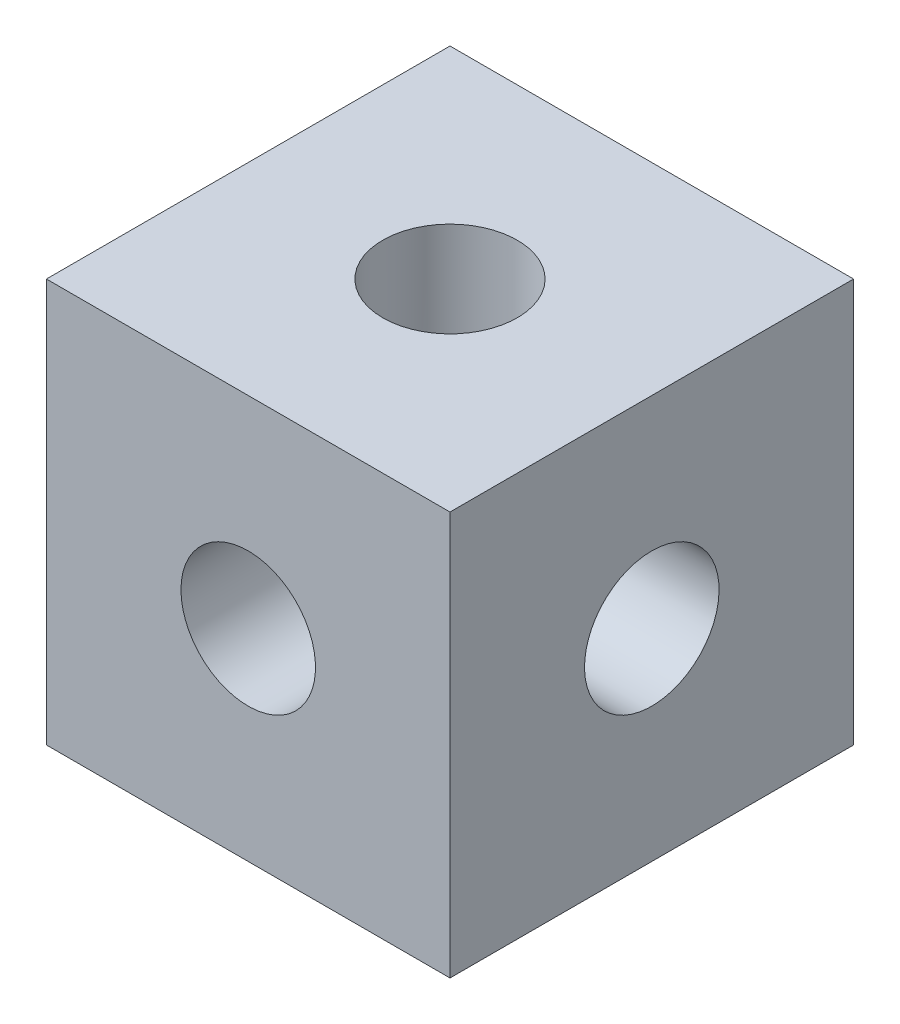
ISO-10303-21;
HEADER;
FILE_DESCRIPTION(('STEP AP214'),'2;1');
FILE_NAME('part.step','',(''),(''),'','','');
FILE_SCHEMA(('AUTOMOTIVE_DESIGN { 1 0 10303 214 1 1 1 1 }'));
ENDSEC;
DATA;
#1=APPLICATION_CONTEXT('core data for automotive mechanical design processes');
#2=APPLICATION_PROTOCOL_DEFINITION('international standard','automotive_design',2000,#1);
#3=PRODUCT_CONTEXT('',#1,'mechanical');
#4=PRODUCT('Part','Part','',(#3));
#5=PRODUCT_RELATED_PRODUCT_CATEGORY('part','',(#4));
#6=PRODUCT_DEFINITION_FORMATION('','',#4);
#7=PRODUCT_DEFINITION_CONTEXT('part definition',#1,'design');
#8=PRODUCT_DEFINITION('design','',#6,#7);
#9=PRODUCT_DEFINITION_SHAPE('','',#8);
#10=(LENGTH_UNIT() NAMED_UNIT(*) SI_UNIT(.MILLI.,.METRE.));
#11=(NAMED_UNIT(*) PLANE_ANGLE_UNIT() SI_UNIT($,.RADIAN.));
#12=(NAMED_UNIT(*) SI_UNIT($,.STERADIAN.) SOLID_ANGLE_UNIT());
#13=UNCERTAINTY_MEASURE_WITH_UNIT(LENGTH_MEASURE(1.E-05),#10,'distance_accuracy_value','');
#14=(GEOMETRIC_REPRESENTATION_CONTEXT(3) GLOBAL_UNCERTAINTY_ASSIGNED_CONTEXT((#13)) GLOBAL_UNIT_ASSIGNED_CONTEXT((#10,
#11,#12)) REPRESENTATION_CONTEXT('',''));
#15=CARTESIAN_POINT('',(0.,0.,0.));
#16=DIRECTION('',(0.,0.,1.));
#17=DIRECTION('',(1.,0.,0.));
#18=AXIS2_PLACEMENT_3D('',#15,#16,#17);
#19=CARTESIAN_POINT('',(0.,-6.,6.));
#20=DIRECTION('',(1.,0.,0.));
#21=DIRECTION('',(0.,1.,0.));
#22=AXIS2_PLACEMENT_3D('',#19,#20,#21);
#23=CYLINDRICAL_SURFACE('',#22,2.);
#24=CARTESIAN_POINT('',(12.,-6.,6.));
#25=DIRECTION('',(1.,0.,0.));
#26=DIRECTION('',(0.,1.,0.));
#27=AXIS2_PLACEMENT_3D('',#24,#25,#26);
#28=CIRCLE('',#27,2.);
#29=CARTESIAN_POINT('',(12.,-4.,6.));
#30=VERTEX_POINT('',#29);
#31=EDGE_CURVE('E148',#30,#30,#28,.T.);
#32=ORIENTED_EDGE('',*,*,#31,.T.);
#33=EDGE_LOOP('',(#32));
#34=FACE_BOUND('',#33,.T.);
#35=CARTESIAN_POINT('',(6.,-6.,6.));
#36=DIRECTION('',(0.707106781186547,0.707106781186548,0.));
#37=DIRECTION('',(0.707106781186548,-0.707106781186547,0.));
#38=AXIS2_PLACEMENT_3D('',#35,#36,#37);
#39=ELLIPSE('',#38,2.82842712474619,2.);
#40=CARTESIAN_POINT('',(7.4142135623731,-7.4142135623731,4.58578643762691));
#41=VERTEX_POINT('',#40);
#42=CARTESIAN_POINT('',(7.41421356237309,-7.4142135623731,7.4142135623731));
#43=VERTEX_POINT('',#42);
#44=EDGE_CURVE('E112',#41,#43,#39,.F.);
#45=ORIENTED_EDGE('',*,*,#44,.T.);
#46=CARTESIAN_POINT('',(6.,-6.,6.));
#47=DIRECTION('',(0.707106781186547,0.,-0.707106781186547));
#48=DIRECTION('',(0.707106781186547,0.,0.707106781186547));
#49=AXIS2_PLACEMENT_3D('',#46,#47,#48);
#50=ELLIPSE('',#49,2.82842712474619,2.);
#51=CARTESIAN_POINT('',(7.4142135623731,-4.58578643762691,7.4142135623731));
#52=VERTEX_POINT('',#51);
#53=EDGE_CURVE('E58',#43,#52,#50,.F.);
#54=ORIENTED_EDGE('',*,*,#53,.T.);
#55=CARTESIAN_POINT('',(6.,-6.,6.));
#56=DIRECTION('',(0.707106781186548,-0.707106781186547,0.));
#57=DIRECTION('',(0.707106781186547,0.707106781186548,0.));
#58=AXIS2_PLACEMENT_3D('',#55,#56,#57);
#59=ELLIPSE('',#58,2.82842712474619,2.);
#60=CARTESIAN_POINT('',(7.4142135623731,-4.58578643762691,4.5857864376269));
#61=VERTEX_POINT('',#60);
#62=EDGE_CURVE('E124',#52,#61,#59,.F.);
#63=ORIENTED_EDGE('',*,*,#62,.T.);
#64=CARTESIAN_POINT('',(6.,-6.,6.));
#65=DIRECTION('',(0.707106781186547,0.,0.707106781186547));
#66=DIRECTION('',(0.707106781186547,0.,-0.707106781186547));
#67=AXIS2_PLACEMENT_3D('',#64,#65,#66);
#68=ELLIPSE('',#67,2.82842712474619,2.);
#69=EDGE_CURVE('E135',#61,#41,#68,.F.);
#70=ORIENTED_EDGE('',*,*,#69,.T.);
#71=EDGE_LOOP('',(#45,#54,#63,#70));
#72=FACE_BOUND('',#71,.T.);
#73=ADVANCED_FACE('F43',(#34,#72),#23,.F.);
#74=CARTESIAN_POINT('',(0.,0.,12.));
#75=DIRECTION('',(1.,0.,0.));
#76=DIRECTION('',(0.,1.,0.));
#77=AXIS2_PLACEMENT_3D('',#74,#75,#76);
#78=PLANE('',#77);
#79=CARTESIAN_POINT('',(0.,-6.,6.));
#80=DIRECTION('',(1.,0.,0.));
#81=DIRECTION('',(0.,1.,0.));
#82=AXIS2_PLACEMENT_3D('',#79,#80,#81);
#83=CIRCLE('',#82,2.);
#84=CARTESIAN_POINT('',(0.,-4.,6.));
#85=VERTEX_POINT('',#84);
#86=EDGE_CURVE('E151',#85,#85,#83,.T.);
#87=ORIENTED_EDGE('',*,*,#86,.T.);
#88=EDGE_LOOP('',(#87));
#89=FACE_BOUND('',#88,.T.);
#90=DIRECTION('',(0.,-1.,0.));
#91=VECTOR('',#90,1.);
#92=CARTESIAN_POINT('',(0.,0.,0.));
#93=LINE('',#92,#91);
#94=CARTESIAN_POINT('',(0.,0.,0.));
#95=VERTEX_POINT('',#94);
#96=CARTESIAN_POINT('',(0.,-12.,0.));
#97=VERTEX_POINT('',#96);
#98=EDGE_CURVE('E154',#95,#97,#93,.T.);
#99=ORIENTED_EDGE('',*,*,#98,.T.);
#100=DIRECTION('',(0.,0.,-1.));
#101=VECTOR('',#100,1.);
#102=CARTESIAN_POINT('',(0.,-12.,12.));
#103=LINE('',#102,#101);
#104=CARTESIAN_POINT('',(0.,-12.,12.));
#105=VERTEX_POINT('',#104);
#106=EDGE_CURVE('E128',#105,#97,#103,.T.);
#107=ORIENTED_EDGE('',*,*,#106,.F.);
#108=DIRECTION('',(0.,-1.,0.));
#109=VECTOR('',#108,1.);
#110=CARTESIAN_POINT('',(0.,0.,12.));
#111=LINE('',#110,#109);
#112=CARTESIAN_POINT('',(0.,0.,12.));
#113=VERTEX_POINT('',#112);
#114=EDGE_CURVE('E157',#113,#105,#111,.T.);
#115=ORIENTED_EDGE('',*,*,#114,.F.);
#116=DIRECTION('',(0.,0.,-1.));
#117=VECTOR('',#116,1.);
#118=CARTESIAN_POINT('',(0.,0.,12.));
#119=LINE('',#118,#117);
#120=EDGE_CURVE('E167',#113,#95,#119,.T.);
#121=ORIENTED_EDGE('',*,*,#120,.T.);
#122=EDGE_LOOP('',(#99,#107,#115,#121));
#123=FACE_BOUND('',#122,.T.);
#124=ADVANCED_FACE('F45',(#89,#123),#78,.F.);
#125=CARTESIAN_POINT('',(0.,-12.,12.));
#126=DIRECTION('',(0.,1.,0.));
#127=DIRECTION('',(0.,0.,1.));
#128=AXIS2_PLACEMENT_3D('',#125,#126,#127);
#129=PLANE('',#128);
#130=CARTESIAN_POINT('',(6.,-12.,6.));
#131=DIRECTION('',(0.,1.,0.));
#132=DIRECTION('',(0.,0.,1.));
#133=AXIS2_PLACEMENT_3D('',#130,#131,#132);
#134=CIRCLE('',#133,2.);
#135=CARTESIAN_POINT('',(6.,-12.,8.));
#136=VERTEX_POINT('',#135);
#137=EDGE_CURVE('E145',#136,#136,#134,.T.);
#138=ORIENTED_EDGE('',*,*,#137,.T.);
#139=EDGE_LOOP('',(#138));
#140=FACE_BOUND('',#139,.T.);
#141=DIRECTION('',(1.,0.,0.));
#142=VECTOR('',#141,1.);
#143=CARTESIAN_POINT('',(0.,-12.,0.));
#144=LINE('',#143,#142);
#145=CARTESIAN_POINT('',(12.,-12.,0.));
#146=VERTEX_POINT('',#145);
#147=EDGE_CURVE('E170',#97,#146,#144,.T.);
#148=ORIENTED_EDGE('',*,*,#147,.T.);
#149=DIRECTION('',(0.,0.,-1.));
#150=VECTOR('',#149,1.);
#151=CARTESIAN_POINT('',(12.,-12.,12.));
#152=LINE('',#151,#150);
#153=CARTESIAN_POINT('',(12.,-12.,12.));
#154=VERTEX_POINT('',#153);
#155=EDGE_CURVE('E180',#154,#146,#152,.T.);
#156=ORIENTED_EDGE('',*,*,#155,.F.);
#157=DIRECTION('',(1.,0.,0.));
#158=VECTOR('',#157,1.);
#159=CARTESIAN_POINT('',(0.,-12.,12.));
#160=LINE('',#159,#158);
#161=EDGE_CURVE('E160',#105,#154,#160,.T.);
#162=ORIENTED_EDGE('',*,*,#161,.F.);
#163=ORIENTED_EDGE('',*,*,#106,.T.);
#164=EDGE_LOOP('',(#148,#156,#162,#163));
#165=FACE_BOUND('',#164,.T.);
#166=ADVANCED_FACE('F185',(#140,#165),#129,.F.);
#167=CARTESIAN_POINT('',(12.,0.,12.));
#168=DIRECTION('',(-1.,0.,0.));
#169=DIRECTION('',(0.,-1.,0.));
#170=AXIS2_PLACEMENT_3D('',#167,#168,#169);
#171=PLANE('',#170);
#172=ORIENTED_EDGE('',*,*,#31,.F.);
#173=EDGE_LOOP('',(#172));
#174=FACE_BOUND('',#173,.T.);
#175=DIRECTION('',(0.,1.,0.));
#176=VECTOR('',#175,1.);
#177=CARTESIAN_POINT('',(12.,0.,0.));
#178=LINE('',#177,#176);
#179=CARTESIAN_POINT('',(12.,0.,0.));
#180=VERTEX_POINT('',#179);
#181=EDGE_CURVE('E172',#146,#180,#178,.T.);
#182=ORIENTED_EDGE('',*,*,#181,.T.);
#183=DIRECTION('',(0.,0.,-1.));
#184=VECTOR('',#183,1.);
#185=CARTESIAN_POINT('',(12.,0.,12.));
#186=LINE('',#185,#184);
#187=CARTESIAN_POINT('',(12.,0.,12.));
#188=VERTEX_POINT('',#187);
#189=EDGE_CURVE('E177',#188,#180,#186,.T.);
#190=ORIENTED_EDGE('',*,*,#189,.F.);
#191=DIRECTION('',(0.,1.,0.));
#192=VECTOR('',#191,1.);
#193=CARTESIAN_POINT('',(12.,0.,12.));
#194=LINE('',#193,#192);
#195=EDGE_CURVE('E163',#154,#188,#194,.T.);
#196=ORIENTED_EDGE('',*,*,#195,.F.);
#197=ORIENTED_EDGE('',*,*,#155,.T.);
#198=EDGE_LOOP('',(#182,#190,#196,#197));
#199=FACE_BOUND('',#198,.T.);
#200=ADVANCED_FACE('F197',(#174,#199),#171,.F.);
#201=CARTESIAN_POINT('',(0.,0.,12.));
#202=DIRECTION('',(0.,-1.,0.));
#203=DIRECTION('',(0.,0.,-1.));
#204=AXIS2_PLACEMENT_3D('',#201,#202,#203);
#205=PLANE('',#204);
#206=CARTESIAN_POINT('',(6.,0.,6.));
#207=DIRECTION('',(0.,1.,0.));
#208=DIRECTION('',(0.,0.,1.));
#209=AXIS2_PLACEMENT_3D('',#206,#207,#208);
#210=CIRCLE('',#209,2.);
#211=CARTESIAN_POINT('',(6.,0.,8.));
#212=VERTEX_POINT('',#211);
#213=EDGE_CURVE('E139',#212,#212,#210,.T.);
#214=ORIENTED_EDGE('',*,*,#213,.F.);
#215=EDGE_LOOP('',(#214));
#216=FACE_BOUND('',#215,.T.);
#217=DIRECTION('',(-1.,0.,0.));
#218=VECTOR('',#217,1.);
#219=CARTESIAN_POINT('',(0.,0.,0.));
#220=LINE('',#219,#218);
#221=EDGE_CURVE('E161',#180,#95,#220,.T.);
#222=ORIENTED_EDGE('',*,*,#221,.T.);
#223=ORIENTED_EDGE('',*,*,#120,.F.);
#224=DIRECTION('',(-1.,0.,0.));
#225=VECTOR('',#224,1.);
#226=CARTESIAN_POINT('',(0.,0.,12.));
#227=LINE('',#226,#225);
#228=EDGE_CURVE('E165',#188,#113,#227,.T.);
#229=ORIENTED_EDGE('',*,*,#228,.F.);
#230=ORIENTED_EDGE('',*,*,#189,.T.);
#231=EDGE_LOOP('',(#222,#223,#229,#230));
#232=FACE_BOUND('',#231,.T.);
#233=ADVANCED_FACE('F201',(#216,#232),#205,.F.);
#234=CARTESIAN_POINT('',(0.,0.,12.));
#235=DIRECTION('',(0.,0.,1.));
#236=DIRECTION('',(1.,0.,0.));
#237=AXIS2_PLACEMENT_3D('',#234,#235,#236);
#238=PLANE('',#237);
#239=CARTESIAN_POINT('',(6.,-6.,12.));
#240=DIRECTION('',(0.,0.,-1.));
#241=DIRECTION('',(-1.,0.,0.));
#242=AXIS2_PLACEMENT_3D('',#239,#240,#241);
#243=CIRCLE('',#242,2.);
#244=CARTESIAN_POINT('',(4.,-6.,12.));
#245=VERTEX_POINT('',#244);
#246=EDGE_CURVE('E121',#245,#245,#243,.T.);
#247=ORIENTED_EDGE('',*,*,#246,.T.);
#248=EDGE_LOOP('',(#247));
#249=FACE_BOUND('',#248,.T.);
#250=ORIENTED_EDGE('',*,*,#114,.T.);
#251=ORIENTED_EDGE('',*,*,#161,.T.);
#252=ORIENTED_EDGE('',*,*,#195,.T.);
#253=ORIENTED_EDGE('',*,*,#228,.T.);
#254=EDGE_LOOP('',(#250,#251,#252,#253));
#255=FACE_BOUND('',#254,.T.);
#256=ADVANCED_FACE('F203',(#249,#255),#238,.T.);
#257=CARTESIAN_POINT('',(0.,0.,0.));
#258=DIRECTION('',(0.,0.,1.));
#259=DIRECTION('',(1.,0.,0.));
#260=AXIS2_PLACEMENT_3D('',#257,#258,#259);
#261=PLANE('',#260);
#262=CARTESIAN_POINT('',(6.,-6.,0.));
#263=DIRECTION('',(0.,0.,-1.));
#264=DIRECTION('',(-1.,0.,0.));
#265=AXIS2_PLACEMENT_3D('',#262,#263,#264);
#266=CIRCLE('',#265,2.);
#267=CARTESIAN_POINT('',(4.,-6.,0.));
#268=VERTEX_POINT('',#267);
#269=EDGE_CURVE('E246',#268,#268,#266,.T.);
#270=ORIENTED_EDGE('',*,*,#269,.F.);
#271=EDGE_LOOP('',(#270));
#272=FACE_BOUND('',#271,.T.);
#273=ORIENTED_EDGE('',*,*,#98,.F.);
#274=ORIENTED_EDGE('',*,*,#221,.F.);
#275=ORIENTED_EDGE('',*,*,#181,.F.);
#276=ORIENTED_EDGE('',*,*,#147,.F.);
#277=EDGE_LOOP('',(#273,#274,#275,#276));
#278=FACE_BOUND('',#277,.T.);
#279=ADVANCED_FACE('F193',(#272,#278),#261,.F.);
#280=CARTESIAN_POINT('',(6.,-6.,6.));
#281=DIRECTION('',(0.707106781186548,-0.707106781186547,0.));
#282=DIRECTION('',(0.707106781186547,0.707106781186548,0.));
#283=AXIS2_PLACEMENT_3D('',#280,#281,#282);
#284=ELLIPSE('',#283,2.82842712474619,2.);
#285=CARTESIAN_POINT('',(4.58578643762691,-7.4142135623731,7.4142135623731));
#286=VERTEX_POINT('',#285);
#287=CARTESIAN_POINT('',(4.58578643762691,-7.4142135623731,4.58578643762691));
#288=VERTEX_POINT('',#287);
#289=EDGE_CURVE('E118',#286,#288,#284,.T.);
#290=ORIENTED_EDGE('',*,*,#289,.T.);
#291=CARTESIAN_POINT('',(6.,-6.,6.));
#292=DIRECTION('',(0.707106781186547,0.,-0.707106781186547));
#293=DIRECTION('',(0.707106781186547,0.,0.707106781186547));
#294=AXIS2_PLACEMENT_3D('',#291,#292,#293);
#295=ELLIPSE('',#294,2.82842712474619,2.);
#296=CARTESIAN_POINT('',(4.58578643762691,-4.58578643762691,4.5857864376269));
#297=VERTEX_POINT('',#296);
#298=EDGE_CURVE('E66',#288,#297,#295,.T.);
#299=ORIENTED_EDGE('',*,*,#298,.T.);
#300=CARTESIAN_POINT('',(6.,-6.,6.));
#301=DIRECTION('',(0.707106781186547,0.707106781186548,0.));
#302=DIRECTION('',(0.707106781186548,-0.707106781186547,0.));
#303=AXIS2_PLACEMENT_3D('',#300,#301,#302);
#304=ELLIPSE('',#303,2.82842712474619,2.);
#305=CARTESIAN_POINT('',(4.58578643762691,-4.58578643762691,7.4142135623731));
#306=VERTEX_POINT('',#305);
#307=EDGE_CURVE('E120',#297,#306,#304,.T.);
#308=ORIENTED_EDGE('',*,*,#307,.T.);
#309=CARTESIAN_POINT('',(6.,-6.,6.));
#310=DIRECTION('',(0.707106781186547,0.,0.707106781186547));
#311=DIRECTION('',(0.707106781186547,0.,-0.707106781186547));
#312=AXIS2_PLACEMENT_3D('',#309,#310,#311);
#313=ELLIPSE('',#312,2.82842712474619,2.);
#314=EDGE_CURVE('E106',#306,#286,#313,.T.);
#315=ORIENTED_EDGE('',*,*,#314,.T.);
#316=EDGE_LOOP('',(#290,#299,#308,#315));
#317=FACE_BOUND('',#316,.T.);
#318=ORIENTED_EDGE('',*,*,#86,.F.);
#319=EDGE_LOOP('',(#318));
#320=FACE_BOUND('',#319,.T.);
#321=ADVANCED_FACE('F116',(#317,#320),#23,.F.);
#322=CARTESIAN_POINT('',(6.,-12.,6.));
#323=DIRECTION('',(0.,1.,0.));
#324=DIRECTION('',(0.,0.,1.));
#325=AXIS2_PLACEMENT_3D('',#322,#323,#324);
#326=CYLINDRICAL_SURFACE('',#325,2.);
#327=ORIENTED_EDGE('',*,*,#213,.T.);
#328=EDGE_LOOP('',(#327));
#329=FACE_BOUND('',#328,.T.);
#330=ORIENTED_EDGE('',*,*,#62,.F.);
#331=CARTESIAN_POINT('',(6.,-6.,6.));
#332=DIRECTION('',(0.,0.707106781186547,-0.707106781186547));
#333=DIRECTION('',(0.,0.707106781186547,0.707106781186547));
#334=AXIS2_PLACEMENT_3D('',#331,#332,#333);
#335=ELLIPSE('',#334,2.82842712474619,2.);
#336=EDGE_CURVE('E141',#52,#306,#335,.F.);
#337=ORIENTED_EDGE('',*,*,#336,.T.);
#338=ORIENTED_EDGE('',*,*,#307,.F.);
#339=CARTESIAN_POINT('',(6.,-6.,6.));
#340=DIRECTION('',(0.,0.707106781186547,0.707106781186547));
#341=DIRECTION('',(0.,0.707106781186547,-0.707106781186547));
#342=AXIS2_PLACEMENT_3D('',#339,#340,#341);
#343=ELLIPSE('',#342,2.82842712474619,2.);
#344=EDGE_CURVE('E137',#297,#61,#343,.F.);
#345=ORIENTED_EDGE('',*,*,#344,.T.);
#346=EDGE_LOOP('',(#330,#337,#338,#345));
#347=FACE_BOUND('',#346,.T.);
#348=ADVANCED_FACE('F225',(#329,#347),#326,.F.);
#349=ORIENTED_EDGE('',*,*,#137,.F.);
#350=EDGE_LOOP('',(#349));
#351=FACE_BOUND('',#350,.T.);
#352=ORIENTED_EDGE('',*,*,#44,.F.);
#353=CARTESIAN_POINT('',(6.,-6.,6.));
#354=DIRECTION('',(0.,0.707106781186547,-0.707106781186547));
#355=DIRECTION('',(0.,0.707106781186547,0.707106781186547));
#356=AXIS2_PLACEMENT_3D('',#353,#354,#355);
#357=ELLIPSE('',#356,2.82842712474619,2.);
#358=EDGE_CURVE('E11',#41,#288,#357,.T.);
#359=ORIENTED_EDGE('',*,*,#358,.T.);
#360=ORIENTED_EDGE('',*,*,#289,.F.);
#361=CARTESIAN_POINT('',(6.,-6.,6.));
#362=DIRECTION('',(0.,0.707106781186547,0.707106781186547));
#363=DIRECTION('',(0.,0.707106781186547,-0.707106781186547));
#364=AXIS2_PLACEMENT_3D('',#361,#362,#363);
#365=ELLIPSE('',#364,2.82842712474619,2.);
#366=EDGE_CURVE('E51',#286,#43,#365,.T.);
#367=ORIENTED_EDGE('',*,*,#366,.T.);
#368=EDGE_LOOP('',(#352,#359,#360,#367));
#369=FACE_BOUND('',#368,.T.);
#370=ADVANCED_FACE('F123',(#351,#369),#326,.F.);
#371=CARTESIAN_POINT('',(6.,-6.,12.));
#372=DIRECTION('',(0.,0.,-1.));
#373=DIRECTION('',(-1.,0.,0.));
#374=AXIS2_PLACEMENT_3D('',#371,#372,#373);
#375=CYLINDRICAL_SURFACE('',#374,2.);
#376=ORIENTED_EDGE('',*,*,#246,.F.);
#377=EDGE_LOOP('',(#376));
#378=FACE_BOUND('',#377,.T.);
#379=ORIENTED_EDGE('',*,*,#53,.F.);
#380=ORIENTED_EDGE('',*,*,#366,.F.);
#381=ORIENTED_EDGE('',*,*,#314,.F.);
#382=ORIENTED_EDGE('',*,*,#336,.F.);
#383=EDGE_LOOP('',(#379,#380,#381,#382));
#384=FACE_BOUND('',#383,.T.);
#385=ADVANCED_FACE('F105',(#378,#384),#375,.F.);
#386=ORIENTED_EDGE('',*,*,#269,.T.);
#387=EDGE_LOOP('',(#386));
#388=FACE_BOUND('',#387,.T.);
#389=ORIENTED_EDGE('',*,*,#298,.F.);
#390=ORIENTED_EDGE('',*,*,#358,.F.);
#391=ORIENTED_EDGE('',*,*,#69,.F.);
#392=ORIENTED_EDGE('',*,*,#344,.F.);
#393=EDGE_LOOP('',(#389,#390,#391,#392));
#394=FACE_BOUND('',#393,.T.);
#395=ADVANCED_FACE('F237',(#388,#394),#375,.F.);
#396=CLOSED_SHELL('',(#73,#124,#166,#200,#233,#256,#279,#321,#348,#370,#385,#395));
#397=MANIFOLD_SOLID_BREP('B2',#396);
#398=ADVANCED_BREP_SHAPE_REPRESENTATION('',(#18,#397),#14);
#399=SHAPE_DEFINITION_REPRESENTATION(#9,#398);
ENDSEC;
END-ISO-10303-21;
